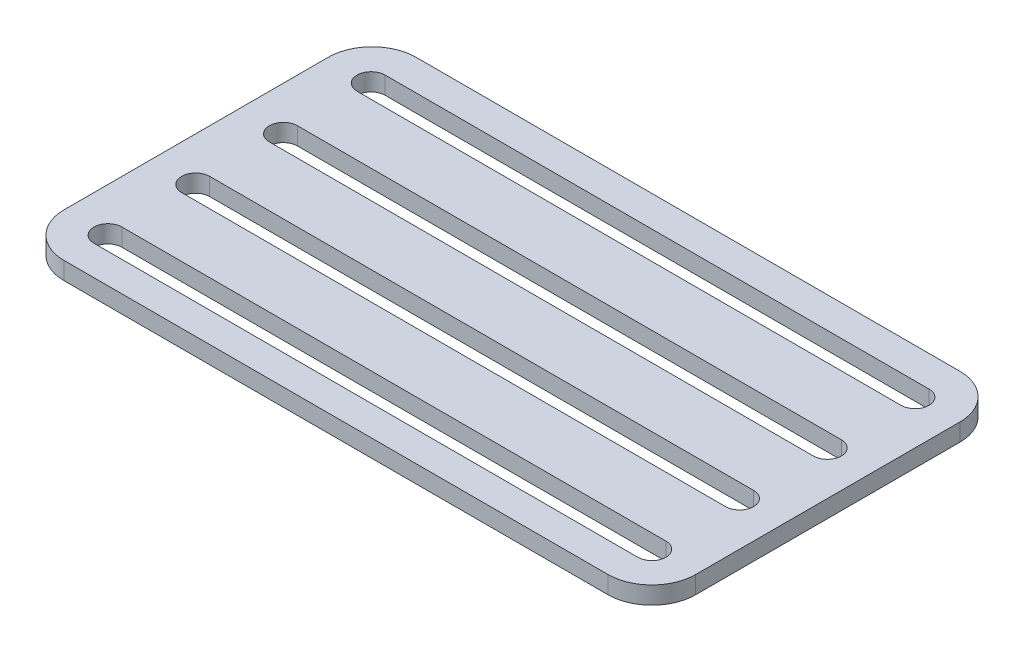
ISO-10303-21;
HEADER;
FILE_DESCRIPTION(('STEP AP214'),'2;1');
FILE_NAME('part.step','',(''),(''),'','','');
FILE_SCHEMA(('AUTOMOTIVE_DESIGN { 1 0 10303 214 1 1 1 1 }'));
ENDSEC;
DATA;
#1=APPLICATION_CONTEXT('core data for automotive mechanical design processes');
#2=APPLICATION_PROTOCOL_DEFINITION('international standard','automotive_design',2000,#1);
#3=PRODUCT_CONTEXT('',#1,'mechanical');
#4=PRODUCT('Part','Part','',(#3));
#5=PRODUCT_RELATED_PRODUCT_CATEGORY('part','',(#4));
#6=PRODUCT_DEFINITION_FORMATION('','',#4);
#7=PRODUCT_DEFINITION_CONTEXT('part definition',#1,'design');
#8=PRODUCT_DEFINITION('design','',#6,#7);
#9=PRODUCT_DEFINITION_SHAPE('','',#8);
#10=(LENGTH_UNIT() NAMED_UNIT(*) SI_UNIT(.MILLI.,.METRE.));
#11=(NAMED_UNIT(*) PLANE_ANGLE_UNIT() SI_UNIT($,.RADIAN.));
#12=(NAMED_UNIT(*) SI_UNIT($,.STERADIAN.) SOLID_ANGLE_UNIT());
#13=UNCERTAINTY_MEASURE_WITH_UNIT(LENGTH_MEASURE(1.E-05),#10,'distance_accuracy_value','');
#14=(GEOMETRIC_REPRESENTATION_CONTEXT(3) GLOBAL_UNCERTAINTY_ASSIGNED_CONTEXT((#13)) GLOBAL_UNIT_ASSIGNED_CONTEXT((#10,
#11,#12)) REPRESENTATION_CONTEXT('',''));
#15=CARTESIAN_POINT('',(0.,0.,0.));
#16=DIRECTION('',(0.,0.,1.));
#17=DIRECTION('',(1.,0.,0.));
#18=AXIS2_PLACEMENT_3D('',#15,#16,#17);
#19=CARTESIAN_POINT('',(-31.,2.,-35.1166851835601));
#20=DIRECTION('',(0.,1.,0.));
#21=DIRECTION('',(0.,0.,1.));
#22=AXIS2_PLACEMENT_3D('',#19,#20,#21);
#23=PLANE('',#22);
#24=CARTESIAN_POINT('',(-31.,2.,-35.1166851835601));
#25=DIRECTION('',(0.,1.,0.));
#26=DIRECTION('',(0.,0.,1.));
#27=AXIS2_PLACEMENT_3D('',#24,#25,#26);
#28=CIRCLE('',#27,5.);
#29=CARTESIAN_POINT('',(-31.,2.,-40.1166851835601));
#30=VERTEX_POINT('',#29);
#31=CARTESIAN_POINT('',(-36.,2.,-35.1166851835601));
#32=VERTEX_POINT('',#31);
#33=EDGE_CURVE('E387',#30,#32,#28,.T.);
#34=ORIENTED_EDGE('',*,*,#33,.T.);
#35=DIRECTION('',(0.,0.,1.));
#36=VECTOR('',#35,1.);
#37=CARTESIAN_POINT('',(-36.,2.,-35.1166851835601));
#38=LINE('',#37,#36);
#39=CARTESIAN_POINT('',(-36.,2.,-5.00000000000003));
#40=VERTEX_POINT('',#39);
#41=EDGE_CURVE('E391',#32,#40,#38,.T.);
#42=ORIENTED_EDGE('',*,*,#41,.T.);
#43=CARTESIAN_POINT('',(-31.,2.,-5.));
#44=DIRECTION('',(0.,1.,0.));
#45=DIRECTION('',(0.,0.,-1.));
#46=AXIS2_PLACEMENT_3D('',#43,#44,#45);
#47=CIRCLE('',#46,5.);
#48=CARTESIAN_POINT('',(-31.,2.,0.));
#49=VERTEX_POINT('',#48);
#50=EDGE_CURVE('E395',#40,#49,#47,.T.);
#51=ORIENTED_EDGE('',*,*,#50,.T.);
#52=DIRECTION('',(1.,0.,0.));
#53=VECTOR('',#52,1.);
#54=CARTESIAN_POINT('',(31.,2.,0.));
#55=LINE('',#54,#53);
#56=CARTESIAN_POINT('',(31.,2.,0.));
#57=VERTEX_POINT('',#56);
#58=EDGE_CURVE('E398',#49,#57,#55,.T.);
#59=ORIENTED_EDGE('',*,*,#58,.T.);
#60=CARTESIAN_POINT('',(31.,2.,-5.));
#61=DIRECTION('',(0.,1.,0.));
#62=DIRECTION('',(0.,0.,1.));
#63=AXIS2_PLACEMENT_3D('',#60,#61,#62);
#64=CIRCLE('',#63,5.);
#65=CARTESIAN_POINT('',(36.,2.,-5.00000000000004));
#66=VERTEX_POINT('',#65);
#67=EDGE_CURVE('E401',#57,#66,#64,.T.);
#68=ORIENTED_EDGE('',*,*,#67,.T.);
#69=DIRECTION('',(0.,0.,-1.));
#70=VECTOR('',#69,1.);
#71=CARTESIAN_POINT('',(36.,2.,-35.1166851835601));
#72=LINE('',#71,#70);
#73=CARTESIAN_POINT('',(36.,2.,-35.1166851835601));
#74=VERTEX_POINT('',#73);
#75=EDGE_CURVE('E404',#66,#74,#72,.T.);
#76=ORIENTED_EDGE('',*,*,#75,.T.);
#77=CARTESIAN_POINT('',(31.,2.,-35.1166851835601));
#78=DIRECTION('',(0.,1.,0.));
#79=DIRECTION('',(0.,0.,-1.));
#80=AXIS2_PLACEMENT_3D('',#77,#78,#79);
#81=CIRCLE('',#80,5.);
#82=CARTESIAN_POINT('',(31.,2.,-40.1166851835601));
#83=VERTEX_POINT('',#82);
#84=EDGE_CURVE('E407',#74,#83,#81,.T.);
#85=ORIENTED_EDGE('',*,*,#84,.T.);
#86=DIRECTION('',(-1.,0.,0.));
#87=VECTOR('',#86,1.);
#88=CARTESIAN_POINT('',(31.,2.,-40.1166851835601));
#89=LINE('',#88,#87);
#90=EDGE_CURVE('E410',#83,#30,#89,.T.);
#91=ORIENTED_EDGE('',*,*,#90,.T.);
#92=EDGE_LOOP('',(#34,#42,#51,#59,#68,#76,#85,#91));
#93=FACE_BOUND('',#92,.T.);
#94=DIRECTION('',(1.,0.,0.));
#95=VECTOR('',#94,1.);
#96=CARTESIAN_POINT('',(-31.,2.,-3.4));
#97=LINE('',#96,#95);
#98=CARTESIAN_POINT('',(-31.,2.,-3.4));
#99=VERTEX_POINT('',#98);
#100=CARTESIAN_POINT('',(31.,2.,-3.39999999999999));
#101=VERTEX_POINT('',#100);
#102=EDGE_CURVE('E346',#99,#101,#97,.T.);
#103=ORIENTED_EDGE('',*,*,#102,.F.);
#104=CARTESIAN_POINT('',(-31.,2.,-5.));
#105=DIRECTION('',(0.,1.,0.));
#106=DIRECTION('',(0.,0.,1.));
#107=AXIS2_PLACEMENT_3D('',#104,#105,#106);
#108=CIRCLE('',#107,1.6);
#109=CARTESIAN_POINT('',(-31.,2.,-6.60000000000001));
#110=VERTEX_POINT('',#109);
#111=EDGE_CURVE('E343',#110,#99,#108,.T.);
#112=ORIENTED_EDGE('',*,*,#111,.F.);
#113=DIRECTION('',(-1.,0.,0.));
#114=VECTOR('',#113,1.);
#115=CARTESIAN_POINT('',(31.,2.,-6.60000000000001));
#116=LINE('',#115,#114);
#117=CARTESIAN_POINT('',(31.,2.,-6.6));
#118=VERTEX_POINT('',#117);
#119=EDGE_CURVE('E354',#118,#110,#116,.T.);
#120=ORIENTED_EDGE('',*,*,#119,.F.);
#121=CARTESIAN_POINT('',(31.,2.,-5.));
#122=DIRECTION('',(0.,1.,0.));
#123=DIRECTION('',(0.,0.,-1.));
#124=AXIS2_PLACEMENT_3D('',#121,#122,#123);
#125=CIRCLE('',#124,1.6);
#126=EDGE_CURVE('E350',#101,#118,#125,.T.);
#127=ORIENTED_EDGE('',*,*,#126,.F.);
#128=EDGE_LOOP('',(#103,#112,#120,#127));
#129=FACE_BOUND('',#128,.T.);
#130=DIRECTION('',(1.,0.,0.));
#131=VECTOR('',#130,1.);
#132=CARTESIAN_POINT('',(-31.,2.,-13.4));
#133=LINE('',#132,#131);
#134=CARTESIAN_POINT('',(-31.,2.,-13.4));
#135=VERTEX_POINT('',#134);
#136=CARTESIAN_POINT('',(31.,2.,-13.4));
#137=VERTEX_POINT('',#136);
#138=EDGE_CURVE('E302',#135,#137,#133,.T.);
#139=ORIENTED_EDGE('',*,*,#138,.F.);
#140=CARTESIAN_POINT('',(-31.,2.,-15.));
#141=DIRECTION('',(0.,1.,0.));
#142=DIRECTION('',(0.,0.,1.));
#143=AXIS2_PLACEMENT_3D('',#140,#141,#142);
#144=CIRCLE('',#143,1.60000000000001);
#145=CARTESIAN_POINT('',(-31.,2.,-16.6));
#146=VERTEX_POINT('',#145);
#147=EDGE_CURVE('E299',#146,#135,#144,.T.);
#148=ORIENTED_EDGE('',*,*,#147,.F.);
#149=DIRECTION('',(-1.,0.,0.));
#150=VECTOR('',#149,1.);
#151=CARTESIAN_POINT('',(31.,2.,-16.6));
#152=LINE('',#151,#150);
#153=CARTESIAN_POINT('',(31.,2.,-16.6));
#154=VERTEX_POINT('',#153);
#155=EDGE_CURVE('E310',#154,#146,#152,.T.);
#156=ORIENTED_EDGE('',*,*,#155,.F.);
#157=CARTESIAN_POINT('',(31.,2.,-15.));
#158=DIRECTION('',(0.,1.,0.));
#159=DIRECTION('',(0.,0.,-1.));
#160=AXIS2_PLACEMENT_3D('',#157,#158,#159);
#161=CIRCLE('',#160,1.60000000000001);
#162=EDGE_CURVE('E306',#137,#154,#161,.T.);
#163=ORIENTED_EDGE('',*,*,#162,.F.);
#164=EDGE_LOOP('',(#139,#148,#156,#163));
#165=FACE_BOUND('',#164,.T.);
#166=DIRECTION('',(1.,0.,0.));
#167=VECTOR('',#166,1.);
#168=CARTESIAN_POINT('',(-31.,2.,-23.4));
#169=LINE('',#168,#167);
#170=CARTESIAN_POINT('',(-31.,2.,-23.4));
#171=VERTEX_POINT('',#170);
#172=CARTESIAN_POINT('',(31.,2.,-23.4));
#173=VERTEX_POINT('',#172);
#174=EDGE_CURVE('E258',#171,#173,#169,.T.);
#175=ORIENTED_EDGE('',*,*,#174,.F.);
#176=CARTESIAN_POINT('',(-31.0000000000001,2.,-25.));
#177=DIRECTION('',(0.,1.,0.));
#178=DIRECTION('',(0.,0.,1.));
#179=AXIS2_PLACEMENT_3D('',#176,#177,#178);
#180=CIRCLE('',#179,1.60000000000001);
#181=CARTESIAN_POINT('',(-31.,2.,-26.6));
#182=VERTEX_POINT('',#181);
#183=EDGE_CURVE('E255',#182,#171,#180,.T.);
#184=ORIENTED_EDGE('',*,*,#183,.F.);
#185=DIRECTION('',(-1.,0.,0.));
#186=VECTOR('',#185,1.);
#187=CARTESIAN_POINT('',(31.,2.,-26.6));
#188=LINE('',#187,#186);
#189=CARTESIAN_POINT('',(31.,2.,-26.6));
#190=VERTEX_POINT('',#189);
#191=EDGE_CURVE('E266',#190,#182,#188,.T.);
#192=ORIENTED_EDGE('',*,*,#191,.F.);
#193=CARTESIAN_POINT('',(31.0000000000001,2.,-25.));
#194=DIRECTION('',(0.,1.,0.));
#195=DIRECTION('',(0.,0.,-1.));
#196=AXIS2_PLACEMENT_3D('',#193,#194,#195);
#197=CIRCLE('',#196,1.60000000000001);
#198=EDGE_CURVE('E262',#173,#190,#197,.T.);
#199=ORIENTED_EDGE('',*,*,#198,.F.);
#200=EDGE_LOOP('',(#175,#184,#192,#199));
#201=FACE_BOUND('',#200,.T.);
#202=DIRECTION('',(1.,0.,0.));
#203=VECTOR('',#202,1.);
#204=CARTESIAN_POINT('',(-31.0000000000001,2.,-33.4));
#205=LINE('',#204,#203);
#206=CARTESIAN_POINT('',(-31.0000000000001,2.,-33.4));
#207=VERTEX_POINT('',#206);
#208=CARTESIAN_POINT('',(31.0000000000001,2.,-33.4));
#209=VERTEX_POINT('',#208);
#210=EDGE_CURVE('E216',#207,#209,#205,.T.);
#211=ORIENTED_EDGE('',*,*,#210,.F.);
#212=CARTESIAN_POINT('',(-31.0000000000001,2.,-35.));
#213=DIRECTION('',(0.,1.,0.));
#214=DIRECTION('',(0.,0.,1.));
#215=AXIS2_PLACEMENT_3D('',#212,#213,#214);
#216=CIRCLE('',#215,1.6);
#217=CARTESIAN_POINT('',(-31.0000000000001,2.,-36.6));
#218=VERTEX_POINT('',#217);
#219=EDGE_CURVE('E207',#218,#207,#216,.T.);
#220=ORIENTED_EDGE('',*,*,#219,.F.);
#221=DIRECTION('',(-1.,0.,0.));
#222=VECTOR('',#221,1.);
#223=CARTESIAN_POINT('',(31.0000000000001,2.,-36.6));
#224=LINE('',#223,#222);
#225=CARTESIAN_POINT('',(31.0000000000001,2.,-36.6));
#226=VERTEX_POINT('',#225);
#227=EDGE_CURVE('E233',#226,#218,#224,.T.);
#228=ORIENTED_EDGE('',*,*,#227,.F.);
#229=CARTESIAN_POINT('',(31.0000000000001,2.,-35.));
#230=DIRECTION('',(0.,1.,0.));
#231=DIRECTION('',(0.,0.,-1.));
#232=AXIS2_PLACEMENT_3D('',#229,#230,#231);
#233=CIRCLE('',#232,1.6);
#234=EDGE_CURVE('E229',#209,#226,#233,.T.);
#235=ORIENTED_EDGE('',*,*,#234,.F.);
#236=EDGE_LOOP('',(#211,#220,#228,#235));
#237=FACE_BOUND('',#236,.T.);
#238=ADVANCED_FACE('F45',(#93,#129,#165,#201,#237),#23,.T.);
#239=CARTESIAN_POINT('',(-31.,0.,-35.1166851835601));
#240=DIRECTION('',(0.,1.,0.));
#241=DIRECTION('',(0.,0.,1.));
#242=AXIS2_PLACEMENT_3D('',#239,#240,#241);
#243=PLANE('',#242);
#244=CARTESIAN_POINT('',(-31.0000000000001,0.,-25.));
#245=DIRECTION('',(0.,1.,0.));
#246=DIRECTION('',(0.,0.,1.));
#247=AXIS2_PLACEMENT_3D('',#244,#245,#246);
#248=CIRCLE('',#247,1.60000000000001);
#249=CARTESIAN_POINT('',(-31.,0.,-26.6));
#250=VERTEX_POINT('',#249);
#251=CARTESIAN_POINT('',(-31.,0.,-23.4));
#252=VERTEX_POINT('',#251);
#253=EDGE_CURVE('E225',#250,#252,#248,.T.);
#254=ORIENTED_EDGE('',*,*,#253,.T.);
#255=DIRECTION('',(1.,0.,0.));
#256=VECTOR('',#255,1.);
#257=CARTESIAN_POINT('',(31.,0.,-23.4));
#258=LINE('',#257,#256);
#259=CARTESIAN_POINT('',(31.,0.,-23.4));
#260=VERTEX_POINT('',#259);
#261=EDGE_CURVE('E273',#252,#260,#258,.T.);
#262=ORIENTED_EDGE('',*,*,#261,.T.);
#263=CARTESIAN_POINT('',(31.0000000000001,0.,-25.));
#264=DIRECTION('',(0.,1.,0.));
#265=DIRECTION('',(0.,0.,-1.));
#266=AXIS2_PLACEMENT_3D('',#263,#264,#265);
#267=CIRCLE('',#266,1.60000000000001);
#268=CARTESIAN_POINT('',(31.,0.,-26.6));
#269=VERTEX_POINT('',#268);
#270=EDGE_CURVE('E277',#260,#269,#267,.T.);
#271=ORIENTED_EDGE('',*,*,#270,.T.);
#272=DIRECTION('',(-1.,0.,0.));
#273=VECTOR('',#272,1.);
#274=CARTESIAN_POINT('',(-31.,0.,-26.6));
#275=LINE('',#274,#273);
#276=EDGE_CURVE('E259',#269,#250,#275,.T.);
#277=ORIENTED_EDGE('',*,*,#276,.T.);
#278=EDGE_LOOP('',(#254,#262,#271,#277));
#279=FACE_BOUND('',#278,.T.);
#280=CARTESIAN_POINT('',(-31.,0.,-5.));
#281=DIRECTION('',(0.,1.,0.));
#282=DIRECTION('',(0.,0.,1.));
#283=AXIS2_PLACEMENT_3D('',#280,#281,#282);
#284=CIRCLE('',#283,1.6);
#285=CARTESIAN_POINT('',(-31.,0.,-6.6));
#286=VERTEX_POINT('',#285);
#287=CARTESIAN_POINT('',(-31.,0.,-3.4));
#288=VERTEX_POINT('',#287);
#289=EDGE_CURVE('E342',#286,#288,#284,.T.);
#290=ORIENTED_EDGE('',*,*,#289,.T.);
#291=DIRECTION('',(1.,0.,0.));
#292=VECTOR('',#291,1.);
#293=CARTESIAN_POINT('',(31.,0.,-3.4));
#294=LINE('',#293,#292);
#295=CARTESIAN_POINT('',(31.,0.,-3.39999999999999));
#296=VERTEX_POINT('',#295);
#297=EDGE_CURVE('E361',#288,#296,#294,.T.);
#298=ORIENTED_EDGE('',*,*,#297,.T.);
#299=CARTESIAN_POINT('',(31.,0.,-5.));
#300=DIRECTION('',(0.,1.,0.));
#301=DIRECTION('',(0.,0.,-1.));
#302=AXIS2_PLACEMENT_3D('',#299,#300,#301);
#303=CIRCLE('',#302,1.6);
#304=CARTESIAN_POINT('',(31.,0.,-6.60000000000001));
#305=VERTEX_POINT('',#304);
#306=EDGE_CURVE('E365',#296,#305,#303,.T.);
#307=ORIENTED_EDGE('',*,*,#306,.T.);
#308=DIRECTION('',(-1.,0.,0.));
#309=VECTOR('',#308,1.);
#310=CARTESIAN_POINT('',(-31.,0.,-6.60000000000001));
#311=LINE('',#310,#309);
#312=EDGE_CURVE('E347',#305,#286,#311,.T.);
#313=ORIENTED_EDGE('',*,*,#312,.T.);
#314=EDGE_LOOP('',(#290,#298,#307,#313));
#315=FACE_BOUND('',#314,.T.);
#316=CARTESIAN_POINT('',(-31.,0.,-35.1166851835601));
#317=DIRECTION('',(0.,1.,0.));
#318=DIRECTION('',(0.,0.,1.));
#319=AXIS2_PLACEMENT_3D('',#316,#317,#318);
#320=CIRCLE('',#319,5.);
#321=CARTESIAN_POINT('',(-31.,0.,-40.1166851835601));
#322=VERTEX_POINT('',#321);
#323=CARTESIAN_POINT('',(-36.,0.,-35.1166851835601));
#324=VERTEX_POINT('',#323);
#325=EDGE_CURVE('E386',#322,#324,#320,.T.);
#326=ORIENTED_EDGE('',*,*,#325,.F.);
#327=DIRECTION('',(-1.,0.,0.));
#328=VECTOR('',#327,1.);
#329=CARTESIAN_POINT('',(31.,0.,-40.1166851835601));
#330=LINE('',#329,#328);
#331=CARTESIAN_POINT('',(31.,0.,-40.1166851835601));
#332=VERTEX_POINT('',#331);
#333=EDGE_CURVE('E392',#332,#322,#330,.T.);
#334=ORIENTED_EDGE('',*,*,#333,.F.);
#335=CARTESIAN_POINT('',(31.,0.,-35.1166851835601));
#336=DIRECTION('',(0.,1.,0.));
#337=DIRECTION('',(0.,0.,-1.));
#338=AXIS2_PLACEMENT_3D('',#335,#336,#337);
#339=CIRCLE('',#338,5.);
#340=CARTESIAN_POINT('',(36.,0.,-35.1166851835601));
#341=VERTEX_POINT('',#340);
#342=EDGE_CURVE('E432',#341,#332,#339,.T.);
#343=ORIENTED_EDGE('',*,*,#342,.F.);
#344=DIRECTION('',(0.,0.,-1.));
#345=VECTOR('',#344,1.);
#346=CARTESIAN_POINT('',(36.,0.,-35.1166851835601));
#347=LINE('',#346,#345);
#348=CARTESIAN_POINT('',(36.,0.,-5.00000000000004));
#349=VERTEX_POINT('',#348);
#350=EDGE_CURVE('E429',#349,#341,#347,.T.);
#351=ORIENTED_EDGE('',*,*,#350,.F.);
#352=CARTESIAN_POINT('',(31.,0.,-5.));
#353=DIRECTION('',(0.,1.,0.));
#354=DIRECTION('',(0.,0.,1.));
#355=AXIS2_PLACEMENT_3D('',#352,#353,#354);
#356=CIRCLE('',#355,5.);
#357=CARTESIAN_POINT('',(31.,0.,0.));
#358=VERTEX_POINT('',#357);
#359=EDGE_CURVE('E426',#358,#349,#356,.T.);
#360=ORIENTED_EDGE('',*,*,#359,.F.);
#361=DIRECTION('',(1.,0.,0.));
#362=VECTOR('',#361,1.);
#363=CARTESIAN_POINT('',(31.,0.,0.));
#364=LINE('',#363,#362);
#365=CARTESIAN_POINT('',(-31.,0.,0.));
#366=VERTEX_POINT('',#365);
#367=EDGE_CURVE('E423',#366,#358,#364,.T.);
#368=ORIENTED_EDGE('',*,*,#367,.F.);
#369=CARTESIAN_POINT('',(-31.,0.,-5.));
#370=DIRECTION('',(0.,1.,0.));
#371=DIRECTION('',(0.,0.,-1.));
#372=AXIS2_PLACEMENT_3D('',#369,#370,#371);
#373=CIRCLE('',#372,5.);
#374=CARTESIAN_POINT('',(-36.,0.,-5.00000000000003));
#375=VERTEX_POINT('',#374);
#376=EDGE_CURVE('E420',#375,#366,#373,.T.);
#377=ORIENTED_EDGE('',*,*,#376,.F.);
#378=DIRECTION('',(0.,0.,1.));
#379=VECTOR('',#378,1.);
#380=CARTESIAN_POINT('',(-36.,0.,-35.1166851835601));
#381=LINE('',#380,#379);
#382=EDGE_CURVE('E417',#324,#375,#381,.T.);
#383=ORIENTED_EDGE('',*,*,#382,.F.);
#384=EDGE_LOOP('',(#326,#334,#343,#351,#360,#368,#377,#383));
#385=FACE_BOUND('',#384,.T.);
#386=CARTESIAN_POINT('',(-31.,0.,-15.));
#387=DIRECTION('',(0.,1.,0.));
#388=DIRECTION('',(0.,0.,1.));
#389=AXIS2_PLACEMENT_3D('',#386,#387,#388);
#390=CIRCLE('',#389,1.60000000000001);
#391=CARTESIAN_POINT('',(-31.,0.,-16.6));
#392=VERTEX_POINT('',#391);
#393=CARTESIAN_POINT('',(-31.,0.,-13.4));
#394=VERTEX_POINT('',#393);
#395=EDGE_CURVE('E298',#392,#394,#390,.T.);
#396=ORIENTED_EDGE('',*,*,#395,.T.);
#397=DIRECTION('',(1.,0.,0.));
#398=VECTOR('',#397,1.);
#399=CARTESIAN_POINT('',(31.,0.,-13.4));
#400=LINE('',#399,#398);
#401=CARTESIAN_POINT('',(31.,0.,-13.4));
#402=VERTEX_POINT('',#401);
#403=EDGE_CURVE('E317',#394,#402,#400,.T.);
#404=ORIENTED_EDGE('',*,*,#403,.T.);
#405=CARTESIAN_POINT('',(31.,0.,-15.));
#406=DIRECTION('',(0.,1.,0.));
#407=DIRECTION('',(0.,0.,-1.));
#408=AXIS2_PLACEMENT_3D('',#405,#406,#407);
#409=CIRCLE('',#408,1.60000000000001);
#410=CARTESIAN_POINT('',(31.,0.,-16.6));
#411=VERTEX_POINT('',#410);
#412=EDGE_CURVE('E321',#402,#411,#409,.T.);
#413=ORIENTED_EDGE('',*,*,#412,.T.);
#414=DIRECTION('',(-1.,0.,0.));
#415=VECTOR('',#414,1.);
#416=CARTESIAN_POINT('',(-31.,0.,-16.6));
#417=LINE('',#416,#415);
#418=EDGE_CURVE('E303',#411,#392,#417,.T.);
#419=ORIENTED_EDGE('',*,*,#418,.T.);
#420=EDGE_LOOP('',(#396,#404,#413,#419));
#421=FACE_BOUND('',#420,.T.);
#422=CARTESIAN_POINT('',(-31.0000000000001,0.,-35.));
#423=DIRECTION('',(0.,1.,0.));
#424=DIRECTION('',(0.,0.,1.));
#425=AXIS2_PLACEMENT_3D('',#422,#423,#424);
#426=CIRCLE('',#425,1.6);
#427=CARTESIAN_POINT('',(-31.0000000000001,0.,-36.6));
#428=VERTEX_POINT('',#427);
#429=CARTESIAN_POINT('',(-31.0000000000001,0.,-33.4));
#430=VERTEX_POINT('',#429);
#431=EDGE_CURVE('E69',#428,#430,#426,.T.);
#432=ORIENTED_EDGE('',*,*,#431,.T.);
#433=DIRECTION('',(1.,0.,0.));
#434=VECTOR('',#433,1.);
#435=CARTESIAN_POINT('',(31.0000000000001,0.,-33.4));
#436=LINE('',#435,#434);
#437=CARTESIAN_POINT('',(31.0000000000001,0.,-33.4));
#438=VERTEX_POINT('',#437);
#439=EDGE_CURVE('E223',#430,#438,#436,.T.);
#440=ORIENTED_EDGE('',*,*,#439,.T.);
#441=CARTESIAN_POINT('',(31.0000000000001,0.,-35.));
#442=DIRECTION('',(0.,1.,0.));
#443=DIRECTION('',(0.,0.,-1.));
#444=AXIS2_PLACEMENT_3D('',#441,#442,#443);
#445=CIRCLE('',#444,1.6);
#446=CARTESIAN_POINT('',(31.0000000000001,0.,-36.6));
#447=VERTEX_POINT('',#446);
#448=EDGE_CURVE('E242',#438,#447,#445,.T.);
#449=ORIENTED_EDGE('',*,*,#448,.T.);
#450=DIRECTION('',(-1.,0.,0.));
#451=VECTOR('',#450,1.);
#452=CARTESIAN_POINT('',(-31.0000000000001,0.,-36.6));
#453=LINE('',#452,#451);
#454=EDGE_CURVE('E217',#447,#428,#453,.T.);
#455=ORIENTED_EDGE('',*,*,#454,.T.);
#456=EDGE_LOOP('',(#432,#440,#449,#455));
#457=FACE_BOUND('',#456,.T.);
#458=ADVANCED_FACE('F471',(#279,#315,#385,#421,#457),#243,.F.);
#459=CARTESIAN_POINT('',(-31.,2.,-35.1166851835601));
#460=DIRECTION('',(0.,-1.,0.));
#461=DIRECTION('',(0.,0.,-1.));
#462=AXIS2_PLACEMENT_3D('',#459,#460,#461);
#463=CYLINDRICAL_SURFACE('',#462,5.);
#464=ORIENTED_EDGE('',*,*,#325,.T.);
#465=DIRECTION('',(0.,-1.,0.));
#466=VECTOR('',#465,1.);
#467=CARTESIAN_POINT('',(-36.,2.,-35.1166851835601));
#468=LINE('',#467,#466);
#469=EDGE_CURVE('E11',#32,#324,#468,.T.);
#470=ORIENTED_EDGE('',*,*,#469,.F.);
#471=ORIENTED_EDGE('',*,*,#33,.F.);
#472=DIRECTION('',(0.,-1.,0.));
#473=VECTOR('',#472,1.);
#474=CARTESIAN_POINT('',(-31.,2.,-40.1166851835601));
#475=LINE('',#474,#473);
#476=EDGE_CURVE('E413',#30,#322,#475,.T.);
#477=ORIENTED_EDGE('',*,*,#476,.T.);
#478=EDGE_LOOP('',(#464,#470,#471,#477));
#479=FACE_BOUND('',#478,.T.);
#480=ADVANCED_FACE('F47',(#479),#463,.T.);
#481=CARTESIAN_POINT('',(-36.,2.,-35.1166851835601));
#482=DIRECTION('',(1.,0.,0.));
#483=DIRECTION('',(0.,0.,-1.));
#484=AXIS2_PLACEMENT_3D('',#481,#482,#483);
#485=PLANE('',#484);
#486=ORIENTED_EDGE('',*,*,#382,.T.);
#487=DIRECTION('',(0.,-1.,0.));
#488=VECTOR('',#487,1.);
#489=CARTESIAN_POINT('',(-36.,2.,-5.00000000000003));
#490=LINE('',#489,#488);
#491=EDGE_CURVE('E54',#40,#375,#490,.T.);
#492=ORIENTED_EDGE('',*,*,#491,.F.);
#493=ORIENTED_EDGE('',*,*,#41,.F.);
#494=ORIENTED_EDGE('',*,*,#469,.T.);
#495=EDGE_LOOP('',(#486,#492,#493,#494));
#496=FACE_BOUND('',#495,.T.);
#497=ADVANCED_FACE('F489',(#496),#485,.F.);
#498=CARTESIAN_POINT('',(-31.,2.,-5.));
#499=DIRECTION('',(0.,-1.,0.));
#500=DIRECTION('',(0.,0.,-1.));
#501=AXIS2_PLACEMENT_3D('',#498,#499,#500);
#502=CYLINDRICAL_SURFACE('',#501,5.);
#503=ORIENTED_EDGE('',*,*,#376,.T.);
#504=DIRECTION('',(0.,-1.,0.));
#505=VECTOR('',#504,1.);
#506=CARTESIAN_POINT('',(-31.,2.,0.));
#507=LINE('',#506,#505);
#508=EDGE_CURVE('E456',#49,#366,#507,.T.);
#509=ORIENTED_EDGE('',*,*,#508,.F.);
#510=ORIENTED_EDGE('',*,*,#50,.F.);
#511=ORIENTED_EDGE('',*,*,#491,.T.);
#512=EDGE_LOOP('',(#503,#509,#510,#511));
#513=FACE_BOUND('',#512,.T.);
#514=ADVANCED_FACE('F465',(#513),#502,.T.);
#515=CARTESIAN_POINT('',(31.,2.,0.));
#516=DIRECTION('',(0.,0.,-1.));
#517=DIRECTION('',(-1.,0.,0.));
#518=AXIS2_PLACEMENT_3D('',#515,#516,#517);
#519=PLANE('',#518);
#520=ORIENTED_EDGE('',*,*,#367,.T.);
#521=DIRECTION('',(0.,-1.,0.));
#522=VECTOR('',#521,1.);
#523=CARTESIAN_POINT('',(31.,2.,0.));
#524=LINE('',#523,#522);
#525=EDGE_CURVE('E452',#57,#358,#524,.T.);
#526=ORIENTED_EDGE('',*,*,#525,.F.);
#527=ORIENTED_EDGE('',*,*,#58,.F.);
#528=ORIENTED_EDGE('',*,*,#508,.T.);
#529=EDGE_LOOP('',(#520,#526,#527,#528));
#530=FACE_BOUND('',#529,.T.);
#531=ADVANCED_FACE('F477',(#530),#519,.F.);
#532=CARTESIAN_POINT('',(31.,2.,-5.));
#533=DIRECTION('',(0.,-1.,0.));
#534=DIRECTION('',(0.,0.,-1.));
#535=AXIS2_PLACEMENT_3D('',#532,#533,#534);
#536=CYLINDRICAL_SURFACE('',#535,5.);
#537=ORIENTED_EDGE('',*,*,#359,.T.);
#538=DIRECTION('',(0.,-1.,0.));
#539=VECTOR('',#538,1.);
#540=CARTESIAN_POINT('',(36.,2.,-5.00000000000004));
#541=LINE('',#540,#539);
#542=EDGE_CURVE('E448',#66,#349,#541,.T.);
#543=ORIENTED_EDGE('',*,*,#542,.F.);
#544=ORIENTED_EDGE('',*,*,#67,.F.);
#545=ORIENTED_EDGE('',*,*,#525,.T.);
#546=EDGE_LOOP('',(#537,#543,#544,#545));
#547=FACE_BOUND('',#546,.T.);
#548=ADVANCED_FACE('F481',(#547),#536,.T.);
#549=CARTESIAN_POINT('',(36.,2.,-35.1166851835601));
#550=DIRECTION('',(-1.,0.,0.));
#551=DIRECTION('',(0.,0.,1.));
#552=AXIS2_PLACEMENT_3D('',#549,#550,#551);
#553=PLANE('',#552);
#554=ORIENTED_EDGE('',*,*,#350,.T.);
#555=DIRECTION('',(0.,-1.,0.));
#556=VECTOR('',#555,1.);
#557=CARTESIAN_POINT('',(36.,2.,-35.1166851835601));
#558=LINE('',#557,#556);
#559=EDGE_CURVE('E444',#74,#341,#558,.T.);
#560=ORIENTED_EDGE('',*,*,#559,.F.);
#561=ORIENTED_EDGE('',*,*,#75,.F.);
#562=ORIENTED_EDGE('',*,*,#542,.T.);
#563=EDGE_LOOP('',(#554,#560,#561,#562));
#564=FACE_BOUND('',#563,.T.);
#565=ADVANCED_FACE('F502',(#564),#553,.F.);
#566=CARTESIAN_POINT('',(31.,2.,-35.1166851835601));
#567=DIRECTION('',(0.,-1.,0.));
#568=DIRECTION('',(0.,0.,-1.));
#569=AXIS2_PLACEMENT_3D('',#566,#567,#568);
#570=CYLINDRICAL_SURFACE('',#569,5.);
#571=ORIENTED_EDGE('',*,*,#342,.T.);
#572=DIRECTION('',(0.,-1.,0.));
#573=VECTOR('',#572,1.);
#574=CARTESIAN_POINT('',(31.,2.,-40.1166851835601));
#575=LINE('',#574,#573);
#576=EDGE_CURVE('E440',#83,#332,#575,.T.);
#577=ORIENTED_EDGE('',*,*,#576,.F.);
#578=ORIENTED_EDGE('',*,*,#84,.F.);
#579=ORIENTED_EDGE('',*,*,#559,.T.);
#580=EDGE_LOOP('',(#571,#577,#578,#579));
#581=FACE_BOUND('',#580,.T.);
#582=ADVANCED_FACE('F500',(#581),#570,.T.);
#583=CARTESIAN_POINT('',(31.,2.,-40.1166851835601));
#584=DIRECTION('',(0.,0.,1.));
#585=DIRECTION('',(1.,0.,0.));
#586=AXIS2_PLACEMENT_3D('',#583,#584,#585);
#587=PLANE('',#586);
#588=ORIENTED_EDGE('',*,*,#333,.T.);
#589=ORIENTED_EDGE('',*,*,#476,.F.);
#590=ORIENTED_EDGE('',*,*,#90,.F.);
#591=ORIENTED_EDGE('',*,*,#576,.T.);
#592=EDGE_LOOP('',(#588,#589,#590,#591));
#593=FACE_BOUND('',#592,.T.);
#594=ADVANCED_FACE('F495',(#593),#587,.F.);
#595=CARTESIAN_POINT('',(-31.,2.,-5.));
#596=DIRECTION('',(0.,-1.,0.));
#597=DIRECTION('',(0.,0.,-1.));
#598=AXIS2_PLACEMENT_3D('',#595,#596,#597);
#599=CYLINDRICAL_SURFACE('',#598,1.6);
#600=ORIENTED_EDGE('',*,*,#289,.F.);
#601=DIRECTION('',(0.,-1.,0.));
#602=VECTOR('',#601,1.);
#603=CARTESIAN_POINT('',(-31.,2.,-6.60000000000001));
#604=LINE('',#603,#602);
#605=EDGE_CURVE('E357',#110,#286,#604,.T.);
#606=ORIENTED_EDGE('',*,*,#605,.F.);
#607=ORIENTED_EDGE('',*,*,#111,.T.);
#608=DIRECTION('',(0.,-1.,0.));
#609=VECTOR('',#608,1.);
#610=CARTESIAN_POINT('',(-31.,2.,-3.4));
#611=LINE('',#610,#609);
#612=EDGE_CURVE('E382',#99,#288,#611,.T.);
#613=ORIENTED_EDGE('',*,*,#612,.T.);
#614=EDGE_LOOP('',(#600,#606,#607,#613));
#615=FACE_BOUND('',#614,.T.);
#616=ADVANCED_FACE('F519',(#615),#599,.F.);
#617=CARTESIAN_POINT('',(31.,2.,-3.4));
#618=DIRECTION('',(0.,0.,-1.));
#619=DIRECTION('',(-1.,0.,0.));
#620=AXIS2_PLACEMENT_3D('',#617,#618,#619);
#621=PLANE('',#620);
#622=ORIENTED_EDGE('',*,*,#297,.F.);
#623=ORIENTED_EDGE('',*,*,#612,.F.);
#624=ORIENTED_EDGE('',*,*,#102,.T.);
#625=DIRECTION('',(0.,-1.,0.));
#626=VECTOR('',#625,1.);
#627=CARTESIAN_POINT('',(31.,2.,-3.39999999999999));
#628=LINE('',#627,#626);
#629=EDGE_CURVE('E379',#101,#296,#628,.T.);
#630=ORIENTED_EDGE('',*,*,#629,.T.);
#631=EDGE_LOOP('',(#622,#623,#624,#630));
#632=FACE_BOUND('',#631,.T.);
#633=ADVANCED_FACE('F526',(#632),#621,.T.);
#634=CARTESIAN_POINT('',(31.,2.,-5.));
#635=DIRECTION('',(0.,-1.,0.));
#636=DIRECTION('',(0.,0.,-1.));
#637=AXIS2_PLACEMENT_3D('',#634,#635,#636);
#638=CYLINDRICAL_SURFACE('',#637,1.6);
#639=ORIENTED_EDGE('',*,*,#306,.F.);
#640=ORIENTED_EDGE('',*,*,#629,.F.);
#641=ORIENTED_EDGE('',*,*,#126,.T.);
#642=DIRECTION('',(0.,-1.,0.));
#643=VECTOR('',#642,1.);
#644=CARTESIAN_POINT('',(31.,2.,-6.60000000000001));
#645=LINE('',#644,#643);
#646=EDGE_CURVE('E375',#118,#305,#645,.T.);
#647=ORIENTED_EDGE('',*,*,#646,.T.);
#648=EDGE_LOOP('',(#639,#640,#641,#647));
#649=FACE_BOUND('',#648,.T.);
#650=ADVANCED_FACE('F531',(#649),#638,.F.);
#651=CARTESIAN_POINT('',(-31.,2.,-6.60000000000001));
#652=DIRECTION('',(0.,0.,1.));
#653=DIRECTION('',(1.,0.,0.));
#654=AXIS2_PLACEMENT_3D('',#651,#652,#653);
#655=PLANE('',#654);
#656=ORIENTED_EDGE('',*,*,#312,.F.);
#657=ORIENTED_EDGE('',*,*,#646,.F.);
#658=ORIENTED_EDGE('',*,*,#119,.T.);
#659=ORIENTED_EDGE('',*,*,#605,.T.);
#660=EDGE_LOOP('',(#656,#657,#658,#659));
#661=FACE_BOUND('',#660,.T.);
#662=ADVANCED_FACE('F538',(#661),#655,.T.);
#663=CARTESIAN_POINT('',(-31.,2.,-15.));
#664=DIRECTION('',(0.,-1.,0.));
#665=DIRECTION('',(0.,0.,-1.));
#666=AXIS2_PLACEMENT_3D('',#663,#664,#665);
#667=CYLINDRICAL_SURFACE('',#666,1.60000000000001);
#668=ORIENTED_EDGE('',*,*,#395,.F.);
#669=DIRECTION('',(0.,-1.,0.));
#670=VECTOR('',#669,1.);
#671=CARTESIAN_POINT('',(-31.,2.,-16.6));
#672=LINE('',#671,#670);
#673=EDGE_CURVE('E313',#146,#392,#672,.T.);
#674=ORIENTED_EDGE('',*,*,#673,.F.);
#675=ORIENTED_EDGE('',*,*,#147,.T.);
#676=DIRECTION('',(0.,-1.,0.));
#677=VECTOR('',#676,1.);
#678=CARTESIAN_POINT('',(-31.,2.,-13.4));
#679=LINE('',#678,#677);
#680=EDGE_CURVE('E338',#135,#394,#679,.T.);
#681=ORIENTED_EDGE('',*,*,#680,.T.);
#682=EDGE_LOOP('',(#668,#674,#675,#681));
#683=FACE_BOUND('',#682,.T.);
#684=ADVANCED_FACE('F591',(#683),#667,.F.);
#685=CARTESIAN_POINT('',(31.,2.,-13.4));
#686=DIRECTION('',(0.,0.,-1.));
#687=DIRECTION('',(-1.,0.,0.));
#688=AXIS2_PLACEMENT_3D('',#685,#686,#687);
#689=PLANE('',#688);
#690=ORIENTED_EDGE('',*,*,#403,.F.);
#691=ORIENTED_EDGE('',*,*,#680,.F.);
#692=ORIENTED_EDGE('',*,*,#138,.T.);
#693=DIRECTION('',(0.,-1.,0.));
#694=VECTOR('',#693,1.);
#695=CARTESIAN_POINT('',(31.,2.,-13.4));
#696=LINE('',#695,#694);
#697=EDGE_CURVE('E335',#137,#402,#696,.T.);
#698=ORIENTED_EDGE('',*,*,#697,.T.);
#699=EDGE_LOOP('',(#690,#691,#692,#698));
#700=FACE_BOUND('',#699,.T.);
#701=ADVANCED_FACE('F587',(#700),#689,.T.);
#702=CARTESIAN_POINT('',(31.,2.,-15.));
#703=DIRECTION('',(0.,-1.,0.));
#704=DIRECTION('',(0.,0.,-1.));
#705=AXIS2_PLACEMENT_3D('',#702,#703,#704);
#706=CYLINDRICAL_SURFACE('',#705,1.60000000000001);
#707=ORIENTED_EDGE('',*,*,#412,.F.);
#708=ORIENTED_EDGE('',*,*,#697,.F.);
#709=ORIENTED_EDGE('',*,*,#162,.T.);
#710=DIRECTION('',(0.,-1.,0.));
#711=VECTOR('',#710,1.);
#712=CARTESIAN_POINT('',(31.,2.,-16.6));
#713=LINE('',#712,#711);
#714=EDGE_CURVE('E331',#154,#411,#713,.T.);
#715=ORIENTED_EDGE('',*,*,#714,.T.);
#716=EDGE_LOOP('',(#707,#708,#709,#715));
#717=FACE_BOUND('',#716,.T.);
#718=ADVANCED_FACE('F583',(#717),#706,.F.);
#719=CARTESIAN_POINT('',(-31.,2.,-16.6));
#720=DIRECTION('',(0.,0.,1.));
#721=DIRECTION('',(1.,0.,0.));
#722=AXIS2_PLACEMENT_3D('',#719,#720,#721);
#723=PLANE('',#722);
#724=ORIENTED_EDGE('',*,*,#418,.F.);
#725=ORIENTED_EDGE('',*,*,#714,.F.);
#726=ORIENTED_EDGE('',*,*,#155,.T.);
#727=ORIENTED_EDGE('',*,*,#673,.T.);
#728=EDGE_LOOP('',(#724,#725,#726,#727));
#729=FACE_BOUND('',#728,.T.);
#730=ADVANCED_FACE('F580',(#729),#723,.T.);
#731=CARTESIAN_POINT('',(-31.0000000000001,2.,-25.));
#732=DIRECTION('',(0.,-1.,0.));
#733=DIRECTION('',(0.,0.,-1.));
#734=AXIS2_PLACEMENT_3D('',#731,#732,#733);
#735=CYLINDRICAL_SURFACE('',#734,1.60000000000001);
#736=ORIENTED_EDGE('',*,*,#253,.F.);
#737=DIRECTION('',(0.,-1.,0.));
#738=VECTOR('',#737,1.);
#739=CARTESIAN_POINT('',(-31.,2.,-26.6));
#740=LINE('',#739,#738);
#741=EDGE_CURVE('E269',#182,#250,#740,.T.);
#742=ORIENTED_EDGE('',*,*,#741,.F.);
#743=ORIENTED_EDGE('',*,*,#183,.T.);
#744=DIRECTION('',(0.,-1.,0.));
#745=VECTOR('',#744,1.);
#746=CARTESIAN_POINT('',(-31.,2.,-23.4));
#747=LINE('',#746,#745);
#748=EDGE_CURVE('E294',#171,#252,#747,.T.);
#749=ORIENTED_EDGE('',*,*,#748,.T.);
#750=EDGE_LOOP('',(#736,#742,#743,#749));
#751=FACE_BOUND('',#750,.T.);
#752=ADVANCED_FACE('F562',(#751),#735,.F.);
#753=CARTESIAN_POINT('',(31.,2.,-23.4));
#754=DIRECTION('',(0.,0.,-1.));
#755=DIRECTION('',(-1.,0.,0.));
#756=AXIS2_PLACEMENT_3D('',#753,#754,#755);
#757=PLANE('',#756);
#758=ORIENTED_EDGE('',*,*,#261,.F.);
#759=ORIENTED_EDGE('',*,*,#748,.F.);
#760=ORIENTED_EDGE('',*,*,#174,.T.);
#761=DIRECTION('',(0.,-1.,0.));
#762=VECTOR('',#761,1.);
#763=CARTESIAN_POINT('',(31.,2.,-23.4));
#764=LINE('',#763,#762);
#765=EDGE_CURVE('E291',#173,#260,#764,.T.);
#766=ORIENTED_EDGE('',*,*,#765,.T.);
#767=EDGE_LOOP('',(#758,#759,#760,#766));
#768=FACE_BOUND('',#767,.T.);
#769=ADVANCED_FACE('F557',(#768),#757,.T.);
#770=CARTESIAN_POINT('',(31.0000000000001,2.,-25.));
#771=DIRECTION('',(0.,-1.,0.));
#772=DIRECTION('',(0.,0.,-1.));
#773=AXIS2_PLACEMENT_3D('',#770,#771,#772);
#774=CYLINDRICAL_SURFACE('',#773,1.60000000000001);
#775=ORIENTED_EDGE('',*,*,#270,.F.);
#776=ORIENTED_EDGE('',*,*,#765,.F.);
#777=ORIENTED_EDGE('',*,*,#198,.T.);
#778=DIRECTION('',(0.,-1.,0.));
#779=VECTOR('',#778,1.);
#780=CARTESIAN_POINT('',(31.,2.,-26.6));
#781=LINE('',#780,#779);
#782=EDGE_CURVE('E287',#190,#269,#781,.T.);
#783=ORIENTED_EDGE('',*,*,#782,.T.);
#784=EDGE_LOOP('',(#775,#776,#777,#783));
#785=FACE_BOUND('',#784,.T.);
#786=ADVANCED_FACE('F560',(#785),#774,.F.);
#787=CARTESIAN_POINT('',(-31.,2.,-26.6));
#788=DIRECTION('',(0.,0.,1.));
#789=DIRECTION('',(1.,0.,0.));
#790=AXIS2_PLACEMENT_3D('',#787,#788,#789);
#791=PLANE('',#790);
#792=ORIENTED_EDGE('',*,*,#276,.F.);
#793=ORIENTED_EDGE('',*,*,#782,.F.);
#794=ORIENTED_EDGE('',*,*,#191,.T.);
#795=ORIENTED_EDGE('',*,*,#741,.T.);
#796=EDGE_LOOP('',(#792,#793,#794,#795));
#797=FACE_BOUND('',#796,.T.);
#798=ADVANCED_FACE('F565',(#797),#791,.T.);
#799=CARTESIAN_POINT('',(-31.0000000000001,2.,-35.));
#800=DIRECTION('',(0.,-1.,0.));
#801=DIRECTION('',(0.,0.,-1.));
#802=AXIS2_PLACEMENT_3D('',#799,#800,#801);
#803=CYLINDRICAL_SURFACE('',#802,1.6);
#804=ORIENTED_EDGE('',*,*,#431,.F.);
#805=DIRECTION('',(0.,-1.,0.));
#806=VECTOR('',#805,1.);
#807=CARTESIAN_POINT('',(-31.0000000000001,2.,-36.6));
#808=LINE('',#807,#806);
#809=EDGE_CURVE('E211',#218,#428,#808,.T.);
#810=ORIENTED_EDGE('',*,*,#809,.F.);
#811=ORIENTED_EDGE('',*,*,#219,.T.);
#812=DIRECTION('',(0.,-1.,0.));
#813=VECTOR('',#812,1.);
#814=CARTESIAN_POINT('',(-31.0000000000001,2.,-33.4));
#815=LINE('',#814,#813);
#816=EDGE_CURVE('E210',#207,#430,#815,.T.);
#817=ORIENTED_EDGE('',*,*,#816,.T.);
#818=EDGE_LOOP('',(#804,#810,#811,#817));
#819=FACE_BOUND('',#818,.T.);
#820=ADVANCED_FACE('F209',(#819),#803,.F.);
#821=CARTESIAN_POINT('',(31.0000000000001,2.,-33.4));
#822=DIRECTION('',(0.,0.,-1.));
#823=DIRECTION('',(-1.,0.,0.));
#824=AXIS2_PLACEMENT_3D('',#821,#822,#823);
#825=PLANE('',#824);
#826=ORIENTED_EDGE('',*,*,#439,.F.);
#827=ORIENTED_EDGE('',*,*,#816,.F.);
#828=ORIENTED_EDGE('',*,*,#210,.T.);
#829=DIRECTION('',(0.,-1.,0.));
#830=VECTOR('',#829,1.);
#831=CARTESIAN_POINT('',(31.0000000000001,2.,-33.4));
#832=LINE('',#831,#830);
#833=EDGE_CURVE('E226',#209,#438,#832,.T.);
#834=ORIENTED_EDGE('',*,*,#833,.T.);
#835=EDGE_LOOP('',(#826,#827,#828,#834));
#836=FACE_BOUND('',#835,.T.);
#837=ADVANCED_FACE('F220',(#836),#825,.T.);
#838=CARTESIAN_POINT('',(31.0000000000001,2.,-35.));
#839=DIRECTION('',(0.,-1.,0.));
#840=DIRECTION('',(0.,0.,-1.));
#841=AXIS2_PLACEMENT_3D('',#838,#839,#840);
#842=CYLINDRICAL_SURFACE('',#841,1.6);
#843=ORIENTED_EDGE('',*,*,#448,.F.);
#844=ORIENTED_EDGE('',*,*,#833,.F.);
#845=ORIENTED_EDGE('',*,*,#234,.T.);
#846=DIRECTION('',(0.,-1.,0.));
#847=VECTOR('',#846,1.);
#848=CARTESIAN_POINT('',(31.0000000000001,2.,-36.6));
#849=LINE('',#848,#847);
#850=EDGE_CURVE('E61',#226,#447,#849,.T.);
#851=ORIENTED_EDGE('',*,*,#850,.T.);
#852=EDGE_LOOP('',(#843,#844,#845,#851));
#853=FACE_BOUND('',#852,.T.);
#854=ADVANCED_FACE('F667',(#853),#842,.F.);
#855=CARTESIAN_POINT('',(-31.0000000000001,2.,-36.6));
#856=DIRECTION('',(0.,0.,1.));
#857=DIRECTION('',(1.,0.,0.));
#858=AXIS2_PLACEMENT_3D('',#855,#856,#857);
#859=PLANE('',#858);
#860=ORIENTED_EDGE('',*,*,#454,.F.);
#861=ORIENTED_EDGE('',*,*,#850,.F.);
#862=ORIENTED_EDGE('',*,*,#227,.T.);
#863=ORIENTED_EDGE('',*,*,#809,.T.);
#864=EDGE_LOOP('',(#860,#861,#862,#863));
#865=FACE_BOUND('',#864,.T.);
#866=ADVANCED_FACE('F678',(#865),#859,.T.);
#867=CLOSED_SHELL('',(#238,#458,#480,#497,#514,#531,#548,#565,#582,#594,#616,#633,#650,#662,
#684,#701,#718,#730,#752,#769,#786,#798,#820,#837,#854,#866));
#868=MANIFOLD_SOLID_BREP('B2',#867);
#869=ADVANCED_BREP_SHAPE_REPRESENTATION('',(#18,#868),#14);
#870=SHAPE_DEFINITION_REPRESENTATION(#9,#869);
ENDSEC;
END-ISO-10303-21;
